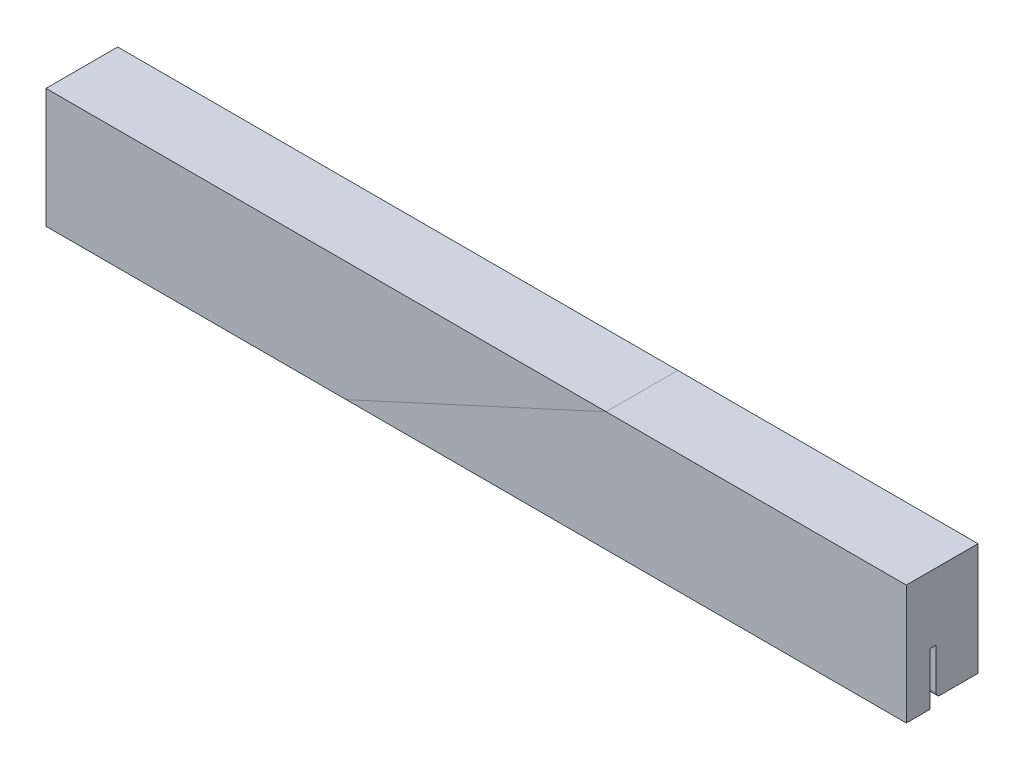
ISO-10303-21;
HEADER;
FILE_DESCRIPTION(('STEP AP214'),'2;1');
FILE_NAME('part.step','',(''),(''),'','','');
FILE_SCHEMA(('AUTOMOTIVE_DESIGN { 1 0 10303 214 1 1 1 1 }'));
ENDSEC;
DATA;
#1=APPLICATION_CONTEXT('core data for automotive mechanical design processes');
#2=APPLICATION_PROTOCOL_DEFINITION('international standard','automotive_design',2000,#1);
#3=PRODUCT_CONTEXT('',#1,'mechanical');
#4=PRODUCT('Part','Part','',(#3));
#5=PRODUCT_RELATED_PRODUCT_CATEGORY('part','',(#4));
#6=PRODUCT_DEFINITION_FORMATION('','',#4);
#7=PRODUCT_DEFINITION_CONTEXT('part definition',#1,'design');
#8=PRODUCT_DEFINITION('design','',#6,#7);
#9=PRODUCT_DEFINITION_SHAPE('','',#8);
#10=(LENGTH_UNIT() NAMED_UNIT(*) SI_UNIT(.MILLI.,.METRE.));
#11=(NAMED_UNIT(*) PLANE_ANGLE_UNIT() SI_UNIT($,.RADIAN.));
#12=(NAMED_UNIT(*) SI_UNIT($,.STERADIAN.) SOLID_ANGLE_UNIT());
#13=UNCERTAINTY_MEASURE_WITH_UNIT(LENGTH_MEASURE(1.E-05),#10,'distance_accuracy_value','');
#14=(GEOMETRIC_REPRESENTATION_CONTEXT(3) GLOBAL_UNCERTAINTY_ASSIGNED_CONTEXT((#13)) GLOBAL_UNIT_ASSIGNED_CONTEXT((#10,
#11,#12)) REPRESENTATION_CONTEXT('',''));
#15=CARTESIAN_POINT('',(0.,0.,0.));
#16=DIRECTION('',(0.,0.,1.));
#17=DIRECTION('',(1.,0.,0.));
#18=AXIS2_PLACEMENT_3D('',#15,#16,#17);
#19=CARTESIAN_POINT('',(-34.5426425520946,-12.7,-12.71));
#20=DIRECTION('',(0.417588267330233,-0.908636362351922,0.));
#21=DIRECTION('',(0.908636362351922,0.417588267330233,0.));
#22=AXIS2_PLACEMENT_3D('',#19,#20,#21);
#23=PLANE('',#22);
#24=DIRECTION('',(0.,0.,1.));
#25=VECTOR('',#24,1.);
#26=CARTESIAN_POINT('',(-34.5426425520946,-12.7,6.35));
#27=LINE('',#26,#25);
#28=CARTESIAN_POINT('',(-34.5426425520946,-12.7,0.));
#29=VERTEX_POINT('',#28);
#30=CARTESIAN_POINT('',(-34.5426425520946,-12.7,6.35));
#31=VERTEX_POINT('',#30);
#32=EDGE_CURVE('E206',#29,#31,#27,.T.);
#33=ORIENTED_EDGE('',*,*,#32,.F.);
#34=DIRECTION('',(0.908636362351922,0.417588267330233,0.));
#35=VECTOR('',#34,1.);
#36=CARTESIAN_POINT('',(-1.20470893229622,2.62134362378733,0.));
#37=LINE('',#36,#35);
#38=CARTESIAN_POINT('',(-4.14511710625137,1.27,0.));
#39=VERTEX_POINT('',#38);
#40=EDGE_CURVE('E143',#29,#39,#37,.T.);
#41=ORIENTED_EDGE('',*,*,#40,.T.);
#42=DIRECTION('',(0.,0.,1.));
#43=VECTOR('',#42,1.);
#44=CARTESIAN_POINT('',(-4.14511710625137,1.27,-1.6002));
#45=LINE('',#44,#43);
#46=CARTESIAN_POINT('',(-4.14511710625134,1.27000000000001,-1.6002));
#47=VERTEX_POINT('',#46);
#48=EDGE_CURVE('E200',#47,#39,#45,.T.);
#49=ORIENTED_EDGE('',*,*,#48,.F.);
#50=DIRECTION('',(0.908636362351922,0.417588267330233,0.));
#51=VECTOR('',#50,1.);
#52=CARTESIAN_POINT('',(119.637508294567,58.1576331703474,-1.6002));
#53=LINE('',#52,#51);
#54=CARTESIAN_POINT('',(-28.1867963225093,-9.779,-1.6002));
#55=VERTEX_POINT('',#54);
#56=EDGE_CURVE('E197',#55,#47,#53,.T.);
#57=ORIENTED_EDGE('',*,*,#56,.F.);
#58=CARTESIAN_POINT('',(-28.1867963225093,-9.779,-2.6162));
#59=DIRECTION('',(0.417588267330233,-0.908636362351922,0.));
#60=DIRECTION('',(0.908636362351922,0.417588267330233,0.));
#61=AXIS2_PLACEMENT_3D('',#58,#59,#60);
#62=ELLIPSE('',#61,2.43301854837923,1.016);
#63=CARTESIAN_POINT('',(-30.3975254458433,-10.795,-2.6162));
#64=VERTEX_POINT('',#63);
#65=EDGE_CURVE('E146',#64,#55,#62,.F.);
#66=ORIENTED_EDGE('',*,*,#65,.F.);
#67=DIRECTION('',(0.,0.,-1.));
#68=VECTOR('',#67,1.);
#69=CARTESIAN_POINT('',(-30.3975254458433,-10.795,-1.60020000000006));
#70=LINE('',#69,#68);
#71=CARTESIAN_POINT('',(-30.3975254458433,-10.795,-12.7));
#72=VERTEX_POINT('',#71);
#73=EDGE_CURVE('E128',#64,#72,#70,.T.);
#74=ORIENTED_EDGE('',*,*,#73,.T.);
#75=DIRECTION('',(0.908636362351922,0.417588267330233,0.));
#76=VECTOR('',#75,1.);
#77=CARTESIAN_POINT('',(-1.20470893229622,2.62134362378733,-12.7));
#78=LINE('',#77,#76);
#79=CARTESIAN_POINT('',(34.5426425520946,19.05,-12.7));
#80=VERTEX_POINT('',#79);
#81=EDGE_CURVE('E135',#72,#80,#78,.T.);
#82=ORIENTED_EDGE('',*,*,#81,.T.);
#83=DIRECTION('',(0.,0.,-1.));
#84=VECTOR('',#83,1.);
#85=CARTESIAN_POINT('',(34.5426425520946,19.05,6.35));
#86=LINE('',#85,#84);
#87=CARTESIAN_POINT('',(34.5426425520946,19.05,6.35));
#88=VERTEX_POINT('',#87);
#89=EDGE_CURVE('E210',#88,#80,#86,.T.);
#90=ORIENTED_EDGE('',*,*,#89,.F.);
#91=DIRECTION('',(0.908636362351922,0.417588267330233,0.));
#92=VECTOR('',#91,1.);
#93=CARTESIAN_POINT('',(-1.20470893229622,2.62134362378733,6.35));
#94=LINE('',#93,#92);
#95=EDGE_CURVE('E203',#31,#88,#94,.T.);
#96=ORIENTED_EDGE('',*,*,#95,.F.);
#97=EDGE_LOOP('',(#33,#41,#49,#57,#66,#74,#82,#90,#96));
#98=FACE_BOUND('',#97,.T.);
#99=ADVANCED_FACE('F53',(#98),#23,.T.);
#100=CARTESIAN_POINT('',(0.,19.05,6.35));
#101=DIRECTION('',(0.,1.,0.));
#102=DIRECTION('',(0.,0.,1.));
#103=AXIS2_PLACEMENT_3D('',#100,#101,#102);
#104=PLANE('',#103);
#105=DIRECTION('',(1.,0.,0.));
#106=VECTOR('',#105,1.);
#107=CARTESIAN_POINT('',(0.,19.05,6.35));
#108=LINE('',#107,#106);
#109=CARTESIAN_POINT('',(-114.3,19.05,6.35));
#110=VERTEX_POINT('',#109);
#111=EDGE_CURVE('E165',#110,#88,#108,.T.);
#112=ORIENTED_EDGE('',*,*,#111,.T.);
#113=ORIENTED_EDGE('',*,*,#89,.T.);
#114=DIRECTION('',(1.,0.,0.));
#115=VECTOR('',#114,1.);
#116=CARTESIAN_POINT('',(0.,19.05,-12.7));
#117=LINE('',#116,#115);
#118=CARTESIAN_POINT('',(-114.3,19.05,-12.7));
#119=VERTEX_POINT('',#118);
#120=EDGE_CURVE('E138',#119,#80,#117,.T.);
#121=ORIENTED_EDGE('',*,*,#120,.F.);
#122=DIRECTION('',(0.,0.,-1.));
#123=VECTOR('',#122,1.);
#124=CARTESIAN_POINT('',(-114.3,19.05,6.35));
#125=LINE('',#124,#123);
#126=EDGE_CURVE('E159',#110,#119,#125,.T.);
#127=ORIENTED_EDGE('',*,*,#126,.F.);
#128=EDGE_LOOP('',(#112,#113,#121,#127));
#129=FACE_BOUND('',#128,.T.);
#130=ADVANCED_FACE('F240',(#129),#104,.T.);
#131=CARTESIAN_POINT('',(0.,0.,0.));
#132=DIRECTION('',(0.,0.,1.));
#133=DIRECTION('',(1.,0.,0.));
#134=AXIS2_PLACEMENT_3D('',#131,#132,#133);
#135=PLANE('',#134);
#136=ORIENTED_EDGE('',*,*,#40,.F.);
#137=DIRECTION('',(-1.,0.,0.));
#138=VECTOR('',#137,1.);
#139=CARTESIAN_POINT('',(0.,-12.7,0.));
#140=LINE('',#139,#138);
#141=CARTESIAN_POINT('',(-114.3,-12.7,0.));
#142=VERTEX_POINT('',#141);
#143=EDGE_CURVE('E169',#29,#142,#140,.T.);
#144=ORIENTED_EDGE('',*,*,#143,.T.);
#145=DIRECTION('',(0.,1.,0.));
#146=VECTOR('',#145,1.);
#147=CARTESIAN_POINT('',(-114.3,0.,0.));
#148=LINE('',#147,#146);
#149=CARTESIAN_POINT('',(-114.3,1.27,0.));
#150=VERTEX_POINT('',#149);
#151=EDGE_CURVE('E172',#142,#150,#148,.T.);
#152=ORIENTED_EDGE('',*,*,#151,.T.);
#153=DIRECTION('',(-1.,0.,0.));
#154=VECTOR('',#153,1.);
#155=CARTESIAN_POINT('',(151.326544532268,1.27,0.));
#156=LINE('',#155,#154);
#157=EDGE_CURVE('E175',#39,#150,#156,.T.);
#158=ORIENTED_EDGE('',*,*,#157,.F.);
#159=EDGE_LOOP('',(#136,#144,#152,#158));
#160=FACE_BOUND('',#159,.T.);
#161=ADVANCED_FACE('F230',(#160),#135,.F.);
#162=CARTESIAN_POINT('',(151.326544532268,1.27,-1.6002));
#163=DIRECTION('',(0.,-1.,0.));
#164=DIRECTION('',(0.,0.,-1.));
#165=AXIS2_PLACEMENT_3D('',#162,#163,#164);
#166=PLANE('',#165);
#167=DIRECTION('',(-1.,0.,0.));
#168=VECTOR('',#167,1.);
#169=CARTESIAN_POINT('',(151.326544532268,1.27,-1.6002));
#170=LINE('',#169,#168);
#171=CARTESIAN_POINT('',(-114.3,1.27,-1.6002));
#172=VERTEX_POINT('',#171);
#173=EDGE_CURVE('E77',#47,#172,#170,.T.);
#174=ORIENTED_EDGE('',*,*,#173,.F.);
#175=ORIENTED_EDGE('',*,*,#48,.T.);
#176=ORIENTED_EDGE('',*,*,#157,.T.);
#177=DIRECTION('',(0.,0.,1.));
#178=VECTOR('',#177,1.);
#179=CARTESIAN_POINT('',(-114.3,1.27,-1.6002));
#180=LINE('',#179,#178);
#181=EDGE_CURVE('E133',#172,#150,#180,.T.);
#182=ORIENTED_EDGE('',*,*,#181,.F.);
#183=EDGE_LOOP('',(#174,#175,#176,#182));
#184=FACE_BOUND('',#183,.T.);
#185=ADVANCED_FACE('F228',(#184),#166,.T.);
#186=CARTESIAN_POINT('',(0.,0.,-12.7));
#187=DIRECTION('',(0.,0.,1.));
#188=DIRECTION('',(1.,0.,0.));
#189=AXIS2_PLACEMENT_3D('',#186,#187,#188);
#190=PLANE('',#189);
#191=ORIENTED_EDGE('',*,*,#81,.F.);
#192=DIRECTION('',(-1.,0.,0.));
#193=VECTOR('',#192,1.);
#194=CARTESIAN_POINT('',(151.326544532268,-10.795,-12.7));
#195=LINE('',#194,#193);
#196=CARTESIAN_POINT('',(-114.3,-10.795,-12.7));
#197=VERTEX_POINT('',#196);
#198=EDGE_CURVE('E57',#72,#197,#195,.T.);
#199=ORIENTED_EDGE('',*,*,#198,.T.);
#200=DIRECTION('',(0.,1.,0.));
#201=VECTOR('',#200,1.);
#202=CARTESIAN_POINT('',(-114.3,0.,-12.7));
#203=LINE('',#202,#201);
#204=EDGE_CURVE('E176',#197,#119,#203,.T.);
#205=ORIENTED_EDGE('',*,*,#204,.T.);
#206=ORIENTED_EDGE('',*,*,#120,.T.);
#207=EDGE_LOOP('',(#191,#199,#205,#206));
#208=FACE_BOUND('',#207,.T.);
#209=ADVANCED_FACE('F136',(#208),#190,.F.);
#210=CARTESIAN_POINT('',(-114.3,0.,6.35));
#211=DIRECTION('',(-1.,0.,0.));
#212=DIRECTION('',(0.,0.,1.));
#213=AXIS2_PLACEMENT_3D('',#210,#211,#212);
#214=PLANE('',#213);
#215=DIRECTION('',(0.,0.,-1.));
#216=VECTOR('',#215,1.);
#217=CARTESIAN_POINT('',(-114.3,-10.795,-1.6002));
#218=LINE('',#217,#216);
#219=CARTESIAN_POINT('',(-114.3,-10.795,-2.6162));
#220=VERTEX_POINT('',#219);
#221=EDGE_CURVE('E12',#220,#197,#218,.T.);
#222=ORIENTED_EDGE('',*,*,#221,.F.);
#223=CARTESIAN_POINT('',(-114.3,-9.779,-2.6162));
#224=DIRECTION('',(-1.,0.,0.));
#225=DIRECTION('',(0.,0.,1.));
#226=AXIS2_PLACEMENT_3D('',#223,#224,#225);
#227=CIRCLE('',#226,1.016);
#228=CARTESIAN_POINT('',(-114.3,-9.779,-1.6002));
#229=VERTEX_POINT('',#228);
#230=EDGE_CURVE('E155',#220,#229,#227,.T.);
#231=ORIENTED_EDGE('',*,*,#230,.T.);
#232=DIRECTION('',(0.,1.,0.));
#233=VECTOR('',#232,1.);
#234=CARTESIAN_POINT('',(-114.3,-10.795,-1.6002));
#235=LINE('',#234,#233);
#236=EDGE_CURVE('E63',#229,#172,#235,.T.);
#237=ORIENTED_EDGE('',*,*,#236,.T.);
#238=ORIENTED_EDGE('',*,*,#181,.T.);
#239=ORIENTED_EDGE('',*,*,#151,.F.);
#240=DIRECTION('',(0.,0.,-1.));
#241=VECTOR('',#240,1.);
#242=CARTESIAN_POINT('',(-114.3,-12.7,6.35));
#243=LINE('',#242,#241);
#244=CARTESIAN_POINT('',(-114.3,-12.7,6.35));
#245=VERTEX_POINT('',#244);
#246=EDGE_CURVE('E164',#245,#142,#243,.T.);
#247=ORIENTED_EDGE('',*,*,#246,.F.);
#248=DIRECTION('',(0.,1.,0.));
#249=VECTOR('',#248,1.);
#250=CARTESIAN_POINT('',(-114.3,0.,6.35));
#251=LINE('',#250,#249);
#252=EDGE_CURVE('E163',#245,#110,#251,.T.);
#253=ORIENTED_EDGE('',*,*,#252,.T.);
#254=ORIENTED_EDGE('',*,*,#126,.T.);
#255=ORIENTED_EDGE('',*,*,#204,.F.);
#256=EDGE_LOOP('',(#222,#231,#237,#238,#239,#247,#253,#254,#255));
#257=FACE_BOUND('',#256,.T.);
#258=ADVANCED_FACE('F225',(#257),#214,.T.);
#259=CARTESIAN_POINT('',(151.326544532268,-10.795,-1.6002));
#260=DIRECTION('',(0.,0.,1.));
#261=DIRECTION('',(1.,0.,0.));
#262=AXIS2_PLACEMENT_3D('',#259,#260,#261);
#263=PLANE('',#262);
#264=DIRECTION('',(-1.,0.,0.));
#265=VECTOR('',#264,1.);
#266=CARTESIAN_POINT('',(114.3,-9.779,-1.6002));
#267=LINE('',#266,#265);
#268=EDGE_CURVE('E151',#229,#55,#267,.F.);
#269=ORIENTED_EDGE('',*,*,#268,.T.);
#270=ORIENTED_EDGE('',*,*,#56,.T.);
#271=ORIENTED_EDGE('',*,*,#173,.T.);
#272=ORIENTED_EDGE('',*,*,#236,.F.);
#273=EDGE_LOOP('',(#269,#270,#271,#272));
#274=FACE_BOUND('',#273,.T.);
#275=ADVANCED_FACE('F244',(#274),#263,.T.);
#276=CARTESIAN_POINT('',(151.326544532268,-10.795,-1.6002));
#277=DIRECTION('',(0.,1.,0.));
#278=DIRECTION('',(0.,0.,1.));
#279=AXIS2_PLACEMENT_3D('',#276,#277,#278);
#280=PLANE('',#279);
#281=ORIENTED_EDGE('',*,*,#73,.F.);
#282=DIRECTION('',(-1.,0.,0.));
#283=VECTOR('',#282,1.);
#284=CARTESIAN_POINT('',(-114.3,-10.795,-2.6162));
#285=LINE('',#284,#283);
#286=EDGE_CURVE('E156',#64,#220,#285,.T.);
#287=ORIENTED_EDGE('',*,*,#286,.T.);
#288=ORIENTED_EDGE('',*,*,#221,.T.);
#289=ORIENTED_EDGE('',*,*,#198,.F.);
#290=EDGE_LOOP('',(#281,#287,#288,#289));
#291=FACE_BOUND('',#290,.T.);
#292=ADVANCED_FACE('F126',(#291),#280,.F.);
#293=CARTESIAN_POINT('',(151.326544532268,-9.779,-2.6162));
#294=DIRECTION('',(1.,0.,0.));
#295=DIRECTION('',(0.,0.,-1.));
#296=AXIS2_PLACEMENT_3D('',#293,#294,#295);
#297=CYLINDRICAL_SURFACE('',#296,1.016);
#298=ORIENTED_EDGE('',*,*,#286,.F.);
#299=ORIENTED_EDGE('',*,*,#65,.T.);
#300=ORIENTED_EDGE('',*,*,#268,.F.);
#301=ORIENTED_EDGE('',*,*,#230,.F.);
#302=EDGE_LOOP('',(#298,#299,#300,#301));
#303=FACE_BOUND('',#302,.T.);
#304=ADVANCED_FACE('F55',(#303),#297,.T.);
#305=CARTESIAN_POINT('',(0.,-12.7,6.35));
#306=DIRECTION('',(0.,-1.,0.));
#307=DIRECTION('',(0.,0.,-1.));
#308=AXIS2_PLACEMENT_3D('',#305,#306,#307);
#309=PLANE('',#308);
#310=ORIENTED_EDGE('',*,*,#143,.F.);
#311=ORIENTED_EDGE('',*,*,#32,.T.);
#312=DIRECTION('',(-1.,0.,0.));
#313=VECTOR('',#312,1.);
#314=CARTESIAN_POINT('',(0.,-12.7,6.35));
#315=LINE('',#314,#313);
#316=EDGE_CURVE('E160',#31,#245,#315,.T.);
#317=ORIENTED_EDGE('',*,*,#316,.T.);
#318=ORIENTED_EDGE('',*,*,#246,.T.);
#319=EDGE_LOOP('',(#310,#311,#317,#318));
#320=FACE_BOUND('',#319,.T.);
#321=ADVANCED_FACE('F233',(#320),#309,.T.);
#322=CARTESIAN_POINT('',(0.,0.,6.35));
#323=DIRECTION('',(0.,0.,1.));
#324=DIRECTION('',(1.,0.,0.));
#325=AXIS2_PLACEMENT_3D('',#322,#323,#324);
#326=PLANE('',#325);
#327=ORIENTED_EDGE('',*,*,#316,.F.);
#328=ORIENTED_EDGE('',*,*,#95,.T.);
#329=ORIENTED_EDGE('',*,*,#111,.F.);
#330=ORIENTED_EDGE('',*,*,#252,.F.);
#331=EDGE_LOOP('',(#327,#328,#329,#330));
#332=FACE_BOUND('',#331,.T.);
#333=ADVANCED_FACE('F238',(#332),#326,.T.);
#334=CLOSED_SHELL('',(#99,#130,#161,#185,#209,#258,#275,#292,#304,#321,#333));
#335=MANIFOLD_SOLID_BREP('B2',#334);
#336=CARTESIAN_POINT('',(-34.5426425520946,-12.7,-12.71));
#337=DIRECTION('',(0.417588267330233,-0.908636362351922,0.));
#338=DIRECTION('',(0.908636362351922,0.417588267330233,0.));
#339=AXIS2_PLACEMENT_3D('',#336,#337,#338);
#340=PLANE('',#339);
#341=DIRECTION('',(0.,0.,1.));
#342=VECTOR('',#341,1.);
#343=CARTESIAN_POINT('',(-34.5426425520946,-12.7,6.35));
#344=LINE('',#343,#342);
#345=CARTESIAN_POINT('',(-34.5426425520946,-12.7,0.));
#346=VERTEX_POINT('',#345);
#347=CARTESIAN_POINT('',(-34.5426425520946,-12.7,6.35));
#348=VERTEX_POINT('',#347);
#349=EDGE_CURVE('E499',#346,#348,#344,.T.);
#350=ORIENTED_EDGE('',*,*,#349,.T.);
#351=DIRECTION('',(0.908636362351922,0.417588267330233,0.));
#352=VECTOR('',#351,1.);
#353=CARTESIAN_POINT('',(-1.20470893229622,2.62134362378733,6.35));
#354=LINE('',#353,#352);
#355=CARTESIAN_POINT('',(34.5426425520946,19.05,6.35));
#356=VERTEX_POINT('',#355);
#357=EDGE_CURVE('E496',#348,#356,#354,.T.);
#358=ORIENTED_EDGE('',*,*,#357,.T.);
#359=DIRECTION('',(0.,0.,-1.));
#360=VECTOR('',#359,1.);
#361=CARTESIAN_POINT('',(34.5426425520946,19.05,6.35));
#362=LINE('',#361,#360);
#363=CARTESIAN_POINT('',(34.5426425520946,19.05,-12.7));
#364=VERTEX_POINT('',#363);
#365=EDGE_CURVE('E502',#356,#364,#362,.T.);
#366=ORIENTED_EDGE('',*,*,#365,.T.);
#367=DIRECTION('',(0.908636362351922,0.417588267330233,0.));
#368=VECTOR('',#367,1.);
#369=CARTESIAN_POINT('',(-1.20470893229622,2.62134362378733,-12.7));
#370=LINE('',#369,#368);
#371=CARTESIAN_POINT('',(-30.3975254458433,-10.795,-12.7));
#372=VERTEX_POINT('',#371);
#373=EDGE_CURVE('E506',#372,#364,#370,.T.);
#374=ORIENTED_EDGE('',*,*,#373,.F.);
#375=DIRECTION('',(0.,0.,-1.));
#376=VECTOR('',#375,1.);
#377=CARTESIAN_POINT('',(-30.3975254458433,-10.795,-1.60020000000006));
#378=LINE('',#377,#376);
#379=CARTESIAN_POINT('',(-30.3975254458433,-10.795,-2.6162));
#380=VERTEX_POINT('',#379);
#381=EDGE_CURVE('E494',#380,#372,#378,.T.);
#382=ORIENTED_EDGE('',*,*,#381,.F.);
#383=CARTESIAN_POINT('',(-28.1867963225093,-9.779,-2.6162));
#384=DIRECTION('',(0.417588267330233,-0.908636362351922,0.));
#385=DIRECTION('',(0.908636362351922,0.417588267330233,0.));
#386=AXIS2_PLACEMENT_3D('',#383,#384,#385);
#387=ELLIPSE('',#386,2.43301854837923,1.016);
#388=CARTESIAN_POINT('',(-28.1867963225093,-9.779,-1.6002));
#389=VERTEX_POINT('',#388);
#390=EDGE_CURVE('E51',#380,#389,#387,.F.);
#391=ORIENTED_EDGE('',*,*,#390,.T.);
#392=DIRECTION('',(0.908636362351922,0.417588267330233,0.));
#393=VECTOR('',#392,1.);
#394=CARTESIAN_POINT('',(119.637508294567,58.1576331703474,-1.6002));
#395=LINE('',#394,#393);
#396=CARTESIAN_POINT('',(-4.14511710625134,1.27000000000001,-1.6002));
#397=VERTEX_POINT('',#396);
#398=EDGE_CURVE('E377',#389,#397,#395,.T.);
#399=ORIENTED_EDGE('',*,*,#398,.T.);
#400=DIRECTION('',(0.,0.,1.));
#401=VECTOR('',#400,1.);
#402=CARTESIAN_POINT('',(-4.14511710625137,1.27,-1.6002));
#403=LINE('',#402,#401);
#404=CARTESIAN_POINT('',(-4.14511710625137,1.27,0.));
#405=VERTEX_POINT('',#404);
#406=EDGE_CURVE('E460',#397,#405,#403,.T.);
#407=ORIENTED_EDGE('',*,*,#406,.T.);
#408=DIRECTION('',(0.908636362351922,0.417588267330233,0.));
#409=VECTOR('',#408,1.);
#410=CARTESIAN_POINT('',(-1.20470893229622,2.62134362378733,0.));
#411=LINE('',#410,#409);
#412=EDGE_CURVE('E372',#346,#405,#411,.T.);
#413=ORIENTED_EDGE('',*,*,#412,.F.);
#414=EDGE_LOOP('',(#350,#358,#366,#374,#382,#391,#399,#407,#413));
#415=FACE_BOUND('',#414,.T.);
#416=ADVANCED_FACE('F369',(#415),#340,.F.);
#417=CARTESIAN_POINT('',(0.,0.,0.));
#418=DIRECTION('',(0.,0.,1.));
#419=DIRECTION('',(1.,0.,0.));
#420=AXIS2_PLACEMENT_3D('',#417,#418,#419);
#421=PLANE('',#420);
#422=DIRECTION('',(-1.,0.,0.));
#423=VECTOR('',#422,1.);
#424=CARTESIAN_POINT('',(0.,-12.7,0.));
#425=LINE('',#424,#423);
#426=CARTESIAN_POINT('',(114.3,-12.7,0.));
#427=VERTEX_POINT('',#426);
#428=EDGE_CURVE('E476',#427,#346,#425,.T.);
#429=ORIENTED_EDGE('',*,*,#428,.T.);
#430=ORIENTED_EDGE('',*,*,#412,.T.);
#431=DIRECTION('',(-1.,0.,0.));
#432=VECTOR('',#431,1.);
#433=CARTESIAN_POINT('',(151.326544532268,1.27,0.));
#434=LINE('',#433,#432);
#435=CARTESIAN_POINT('',(114.3,1.27,0.));
#436=VERTEX_POINT('',#435);
#437=EDGE_CURVE('E461',#436,#405,#434,.T.);
#438=ORIENTED_EDGE('',*,*,#437,.F.);
#439=DIRECTION('',(0.,1.,0.));
#440=VECTOR('',#439,1.);
#441=CARTESIAN_POINT('',(114.3,0.,0.));
#442=LINE('',#441,#440);
#443=EDGE_CURVE('E447',#427,#436,#442,.T.);
#444=ORIENTED_EDGE('',*,*,#443,.F.);
#445=EDGE_LOOP('',(#429,#430,#438,#444));
#446=FACE_BOUND('',#445,.T.);
#447=ADVANCED_FACE('F511',(#446),#421,.F.);
#448=CARTESIAN_POINT('',(114.3,0.,6.35));
#449=DIRECTION('',(-1.,0.,0.));
#450=DIRECTION('',(0.,0.,1.));
#451=AXIS2_PLACEMENT_3D('',#448,#449,#450);
#452=PLANE('',#451);
#453=DIRECTION('',(0.,-1.,0.));
#454=VECTOR('',#453,1.);
#455=CARTESIAN_POINT('',(114.3,-10.795,-1.6002));
#456=LINE('',#455,#454);
#457=CARTESIAN_POINT('',(114.3,1.27,-1.6002));
#458=VERTEX_POINT('',#457);
#459=CARTESIAN_POINT('',(114.3,-9.779,-1.6002));
#460=VERTEX_POINT('',#459);
#461=EDGE_CURVE('E444',#458,#460,#456,.T.);
#462=ORIENTED_EDGE('',*,*,#461,.T.);
#463=CARTESIAN_POINT('',(114.3,-9.779,-2.6162));
#464=DIRECTION('',(-1.,0.,0.));
#465=DIRECTION('',(0.,0.,1.));
#466=AXIS2_PLACEMENT_3D('',#463,#464,#465);
#467=CIRCLE('',#466,1.016);
#468=CARTESIAN_POINT('',(114.3,-10.795,-2.6162));
#469=VERTEX_POINT('',#468);
#470=EDGE_CURVE('E493',#460,#469,#467,.F.);
#471=ORIENTED_EDGE('',*,*,#470,.T.);
#472=DIRECTION('',(0.,0.,1.));
#473=VECTOR('',#472,1.);
#474=CARTESIAN_POINT('',(114.3,-10.795,-1.6002));
#475=LINE('',#474,#473);
#476=CARTESIAN_POINT('',(114.3,-10.795,-12.7));
#477=VERTEX_POINT('',#476);
#478=EDGE_CURVE('E456',#477,#469,#475,.T.);
#479=ORIENTED_EDGE('',*,*,#478,.F.);
#480=DIRECTION('',(0.,1.,0.));
#481=VECTOR('',#480,1.);
#482=CARTESIAN_POINT('',(114.3,0.,-12.7));
#483=LINE('',#482,#481);
#484=CARTESIAN_POINT('',(114.3,19.05,-12.7));
#485=VERTEX_POINT('',#484);
#486=EDGE_CURVE('E451',#477,#485,#483,.T.);
#487=ORIENTED_EDGE('',*,*,#486,.T.);
#488=DIRECTION('',(0.,0.,-1.));
#489=VECTOR('',#488,1.);
#490=CARTESIAN_POINT('',(114.3,19.05,6.35));
#491=LINE('',#490,#489);
#492=CARTESIAN_POINT('',(114.3,19.05,6.35));
#493=VERTEX_POINT('',#492);
#494=EDGE_CURVE('E486',#493,#485,#491,.T.);
#495=ORIENTED_EDGE('',*,*,#494,.F.);
#496=DIRECTION('',(0.,1.,0.));
#497=VECTOR('',#496,1.);
#498=CARTESIAN_POINT('',(114.3,0.,6.35));
#499=LINE('',#498,#497);
#500=CARTESIAN_POINT('',(114.3,-12.7,6.35));
#501=VERTEX_POINT('',#500);
#502=EDGE_CURVE('E472',#501,#493,#499,.T.);
#503=ORIENTED_EDGE('',*,*,#502,.F.);
#504=DIRECTION('',(0.,0.,-1.));
#505=VECTOR('',#504,1.);
#506=CARTESIAN_POINT('',(114.3,-12.7,6.35));
#507=LINE('',#506,#505);
#508=EDGE_CURVE('E481',#501,#427,#507,.T.);
#509=ORIENTED_EDGE('',*,*,#508,.T.);
#510=ORIENTED_EDGE('',*,*,#443,.T.);
#511=DIRECTION('',(0.,0.,-1.));
#512=VECTOR('',#511,1.);
#513=CARTESIAN_POINT('',(114.3,1.27,-1.6002));
#514=LINE('',#513,#512);
#515=EDGE_CURVE('E441',#436,#458,#514,.T.);
#516=ORIENTED_EDGE('',*,*,#515,.T.);
#517=EDGE_LOOP('',(#462,#471,#479,#487,#495,#503,#509,#510,#516));
#518=FACE_BOUND('',#517,.T.);
#519=ADVANCED_FACE('F443',(#518),#452,.F.);
#520=CARTESIAN_POINT('',(0.,19.05,6.35));
#521=DIRECTION('',(0.,1.,0.));
#522=DIRECTION('',(0.,0.,1.));
#523=AXIS2_PLACEMENT_3D('',#520,#521,#522);
#524=PLANE('',#523);
#525=ORIENTED_EDGE('',*,*,#365,.F.);
#526=DIRECTION('',(1.,0.,0.));
#527=VECTOR('',#526,1.);
#528=CARTESIAN_POINT('',(0.,19.05,6.35));
#529=LINE('',#528,#527);
#530=EDGE_CURVE('E475',#356,#493,#529,.T.);
#531=ORIENTED_EDGE('',*,*,#530,.T.);
#532=ORIENTED_EDGE('',*,*,#494,.T.);
#533=DIRECTION('',(1.,0.,0.));
#534=VECTOR('',#533,1.);
#535=CARTESIAN_POINT('',(0.,19.05,-12.7));
#536=LINE('',#535,#534);
#537=EDGE_CURVE('E470',#364,#485,#536,.T.);
#538=ORIENTED_EDGE('',*,*,#537,.F.);
#539=EDGE_LOOP('',(#525,#531,#532,#538));
#540=FACE_BOUND('',#539,.T.);
#541=ADVANCED_FACE('F528',(#540),#524,.T.);
#542=CARTESIAN_POINT('',(0.,-12.7,6.35));
#543=DIRECTION('',(0.,-1.,0.));
#544=DIRECTION('',(0.,0.,-1.));
#545=AXIS2_PLACEMENT_3D('',#542,#543,#544);
#546=PLANE('',#545);
#547=ORIENTED_EDGE('',*,*,#349,.F.);
#548=ORIENTED_EDGE('',*,*,#428,.F.);
#549=ORIENTED_EDGE('',*,*,#508,.F.);
#550=DIRECTION('',(-1.,0.,0.));
#551=VECTOR('',#550,1.);
#552=CARTESIAN_POINT('',(0.,-12.7,6.35));
#553=LINE('',#552,#551);
#554=EDGE_CURVE('E478',#501,#348,#553,.T.);
#555=ORIENTED_EDGE('',*,*,#554,.T.);
#556=EDGE_LOOP('',(#547,#548,#549,#555));
#557=FACE_BOUND('',#556,.T.);
#558=ADVANCED_FACE('F533',(#557),#546,.T.);
#559=CARTESIAN_POINT('',(0.,0.,6.35));
#560=DIRECTION('',(0.,0.,1.));
#561=DIRECTION('',(1.,0.,0.));
#562=AXIS2_PLACEMENT_3D('',#559,#560,#561);
#563=PLANE('',#562);
#564=ORIENTED_EDGE('',*,*,#357,.F.);
#565=ORIENTED_EDGE('',*,*,#554,.F.);
#566=ORIENTED_EDGE('',*,*,#502,.T.);
#567=ORIENTED_EDGE('',*,*,#530,.F.);
#568=EDGE_LOOP('',(#564,#565,#566,#567));
#569=FACE_BOUND('',#568,.T.);
#570=ADVANCED_FACE('F531',(#569),#563,.T.);
#571=CARTESIAN_POINT('',(0.,0.,-12.7));
#572=DIRECTION('',(0.,0.,1.));
#573=DIRECTION('',(1.,0.,0.));
#574=AXIS2_PLACEMENT_3D('',#571,#572,#573);
#575=PLANE('',#574);
#576=DIRECTION('',(-1.,0.,0.));
#577=VECTOR('',#576,1.);
#578=CARTESIAN_POINT('',(151.326544532268,-10.795,-12.7));
#579=LINE('',#578,#577);
#580=EDGE_CURVE('E462',#477,#372,#579,.T.);
#581=ORIENTED_EDGE('',*,*,#580,.T.);
#582=ORIENTED_EDGE('',*,*,#373,.T.);
#583=ORIENTED_EDGE('',*,*,#537,.T.);
#584=ORIENTED_EDGE('',*,*,#486,.F.);
#585=EDGE_LOOP('',(#581,#582,#583,#584));
#586=FACE_BOUND('',#585,.T.);
#587=ADVANCED_FACE('F522',(#586),#575,.F.);
#588=CARTESIAN_POINT('',(151.326544532268,1.27,-1.6002));
#589=DIRECTION('',(0.,-1.,0.));
#590=DIRECTION('',(0.,0.,-1.));
#591=AXIS2_PLACEMENT_3D('',#588,#589,#590);
#592=PLANE('',#591);
#593=ORIENTED_EDGE('',*,*,#406,.F.);
#594=DIRECTION('',(-1.,0.,0.));
#595=VECTOR('',#594,1.);
#596=CARTESIAN_POINT('',(151.326544532268,1.27,-1.6002));
#597=LINE('',#596,#595);
#598=EDGE_CURVE('E454',#458,#397,#597,.T.);
#599=ORIENTED_EDGE('',*,*,#598,.F.);
#600=ORIENTED_EDGE('',*,*,#515,.F.);
#601=ORIENTED_EDGE('',*,*,#437,.T.);
#602=EDGE_LOOP('',(#593,#599,#600,#601));
#603=FACE_BOUND('',#602,.T.);
#604=ADVANCED_FACE('F458',(#603),#592,.T.);
#605=CARTESIAN_POINT('',(151.326544532268,-10.795,-1.6002));
#606=DIRECTION('',(0.,0.,1.));
#607=DIRECTION('',(1.,0.,0.));
#608=AXIS2_PLACEMENT_3D('',#605,#606,#607);
#609=PLANE('',#608);
#610=ORIENTED_EDGE('',*,*,#398,.F.);
#611=DIRECTION('',(-1.,0.,0.));
#612=VECTOR('',#611,1.);
#613=CARTESIAN_POINT('',(114.3,-9.779,-1.6002));
#614=LINE('',#613,#612);
#615=EDGE_CURVE('E455',#389,#460,#614,.F.);
#616=ORIENTED_EDGE('',*,*,#615,.T.);
#617=ORIENTED_EDGE('',*,*,#461,.F.);
#618=ORIENTED_EDGE('',*,*,#598,.T.);
#619=EDGE_LOOP('',(#610,#616,#617,#618));
#620=FACE_BOUND('',#619,.T.);
#621=ADVANCED_FACE('F453',(#620),#609,.T.);
#622=CARTESIAN_POINT('',(151.326544532268,-10.795,-1.6002));
#623=DIRECTION('',(0.,1.,0.));
#624=DIRECTION('',(0.,0.,1.));
#625=AXIS2_PLACEMENT_3D('',#622,#623,#624);
#626=PLANE('',#625);
#627=DIRECTION('',(-1.,0.,0.));
#628=VECTOR('',#627,1.);
#629=CARTESIAN_POINT('',(-114.3,-10.795,-2.6162));
#630=LINE('',#629,#628);
#631=EDGE_CURVE('E489',#469,#380,#630,.T.);
#632=ORIENTED_EDGE('',*,*,#631,.T.);
#633=ORIENTED_EDGE('',*,*,#381,.T.);
#634=ORIENTED_EDGE('',*,*,#580,.F.);
#635=ORIENTED_EDGE('',*,*,#478,.T.);
#636=EDGE_LOOP('',(#632,#633,#634,#635));
#637=FACE_BOUND('',#636,.T.);
#638=ADVANCED_FACE('F520',(#637),#626,.F.);
#639=CARTESIAN_POINT('',(151.326544532268,-9.779,-2.6162));
#640=DIRECTION('',(1.,0.,0.));
#641=DIRECTION('',(0.,0.,-1.));
#642=AXIS2_PLACEMENT_3D('',#639,#640,#641);
#643=CYLINDRICAL_SURFACE('',#642,1.016);
#644=ORIENTED_EDGE('',*,*,#390,.F.);
#645=ORIENTED_EDGE('',*,*,#631,.F.);
#646=ORIENTED_EDGE('',*,*,#470,.F.);
#647=ORIENTED_EDGE('',*,*,#615,.F.);
#648=EDGE_LOOP('',(#644,#645,#646,#647));
#649=FACE_BOUND('',#648,.T.);
#650=ADVANCED_FACE('F515',(#649),#643,.T.);
#651=CLOSED_SHELL('',(#416,#447,#519,#541,#558,#570,#587,#604,#621,#638,#650));
#652=MANIFOLD_SOLID_BREP('B6',#651);
#653=ADVANCED_BREP_SHAPE_REPRESENTATION('',(#18,#335,#652),#14);
#654=SHAPE_DEFINITION_REPRESENTATION(#9,#653);
ENDSEC;
END-ISO-10303-21;
